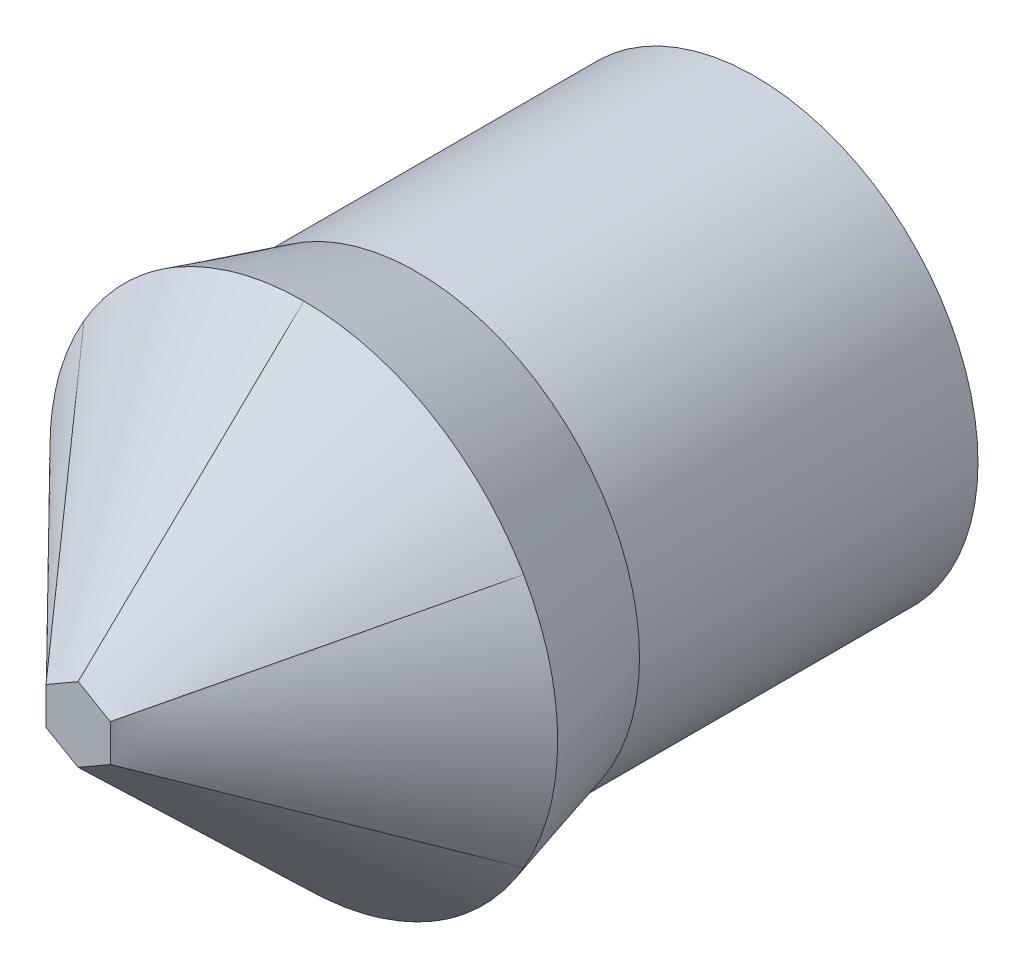
ISO-10303-21;
HEADER;
FILE_DESCRIPTION(('STEP AP214'),'2;1');
FILE_NAME('part.step','',(''),(''),'','','');
FILE_SCHEMA(('AUTOMOTIVE_DESIGN { 1 0 10303 214 1 1 1 1 }'));
ENDSEC;
DATA;
#1=APPLICATION_CONTEXT('core data for automotive mechanical design processes');
#2=APPLICATION_PROTOCOL_DEFINITION('international standard','automotive_design',2000,#1);
#3=PRODUCT_CONTEXT('',#1,'mechanical');
#4=PRODUCT('Part','Part','',(#3));
#5=PRODUCT_RELATED_PRODUCT_CATEGORY('part','',(#4));
#6=PRODUCT_DEFINITION_FORMATION('','',#4);
#7=PRODUCT_DEFINITION_CONTEXT('part definition',#1,'design');
#8=PRODUCT_DEFINITION('design','',#6,#7);
#9=PRODUCT_DEFINITION_SHAPE('','',#8);
#10=(LENGTH_UNIT() NAMED_UNIT(*) SI_UNIT(.MILLI.,.METRE.));
#11=(NAMED_UNIT(*) PLANE_ANGLE_UNIT() SI_UNIT($,.RADIAN.));
#12=(NAMED_UNIT(*) SI_UNIT($,.STERADIAN.) SOLID_ANGLE_UNIT());
#13=UNCERTAINTY_MEASURE_WITH_UNIT(LENGTH_MEASURE(1.E-05),#10,'distance_accuracy_value','');
#14=(GEOMETRIC_REPRESENTATION_CONTEXT(3) GLOBAL_UNCERTAINTY_ASSIGNED_CONTEXT((#13)) GLOBAL_UNIT_ASSIGNED_CONTEXT((#10,
#11,#12)) REPRESENTATION_CONTEXT('',''));
#15=CARTESIAN_POINT('',(0.,0.,0.));
#16=DIRECTION('',(0.,0.,1.));
#17=DIRECTION('',(1.,0.,0.));
#18=AXIS2_PLACEMENT_3D('',#15,#16,#17);
#19=CARTESIAN_POINT('',(0.,0.,6.));
#20=DIRECTION('',(0.,0.,-1.));
#21=DIRECTION('',(-1.,0.,0.));
#22=AXIS2_PLACEMENT_3D('',#19,#20,#21);
#23=CYLINDRICAL_SURFACE('',#22,3.95);
#24=CARTESIAN_POINT('',(0.,0.,6.));
#25=DIRECTION('',(0.,0.,1.));
#26=DIRECTION('',(1.,0.,0.));
#27=AXIS2_PLACEMENT_3D('',#24,#25,#26);
#28=CIRCLE('',#27,3.95);
#29=CARTESIAN_POINT('',(3.95,0.,6.));
#30=VERTEX_POINT('',#29);
#31=EDGE_CURVE('E12',#30,#30,#28,.T.);
#32=ORIENTED_EDGE('',*,*,#31,.F.);
#33=EDGE_LOOP('',(#32));
#34=FACE_BOUND('',#33,.T.);
#35=CARTESIAN_POINT('',(0.,0.,0.));
#36=DIRECTION('',(0.,0.,1.));
#37=DIRECTION('',(1.,0.,0.));
#38=AXIS2_PLACEMENT_3D('',#35,#36,#37);
#39=CIRCLE('',#38,3.95);
#40=CARTESIAN_POINT('',(3.95,0.,0.));
#41=VERTEX_POINT('',#40);
#42=EDGE_CURVE('E93',#41,#41,#39,.T.);
#43=ORIENTED_EDGE('',*,*,#42,.T.);
#44=EDGE_LOOP('',(#43));
#45=FACE_BOUND('',#44,.T.);
#46=ADVANCED_FACE('F79',(#34,#45),#23,.T.);
#47=CARTESIAN_POINT('',(0.,0.,0.));
#48=DIRECTION('',(0.,0.,1.));
#49=DIRECTION('',(1.,0.,0.));
#50=AXIS2_PLACEMENT_3D('',#47,#48,#49);
#51=PLANE('',#50);
#52=ORIENTED_EDGE('',*,*,#42,.F.);
#53=EDGE_LOOP('',(#52));
#54=FACE_BOUND('',#53,.T.);
#55=ADVANCED_FACE('F347',(#54),#51,.F.);
#56=CARTESIAN_POINT('',(0.,0.,6.));
#57=DIRECTION('',(0.,0.,1.));
#58=DIRECTION('',(1.,0.,0.));
#59=AXIS2_PLACEMENT_3D('',#56,#57,#58);
#60=CONICAL_SURFACE('',#59,3.95,0.268366210905907);
#61=CARTESIAN_POINT('',(3.89711431702996,2.25000000000002,8.));
#62=CARTESIAN_POINT('',(3.83869948859132,2.35118469901196,7.99997786592771));
#63=CARTESIAN_POINT('',(3.77632633594995,2.45008029614342,7.99994361975812));
#64=CARTESIAN_POINT('',(3.64409186469847,2.64271859279688,7.9998961356535));
#65=CARTESIAN_POINT('',(3.5742312422977,2.73646177018351,7.99988289576704));
#66=CARTESIAN_POINT('',(3.42746983719847,2.91820173295288,7.99992262747231));
#67=CARTESIAN_POINT('',(3.35057199542261,3.00620089271256,7.99997557152118));
#68=CARTESIAN_POINT('',(3.19014759800274,3.17594080167324,8.00000194954762));
#69=CARTESIAN_POINT('',(3.10662068043718,3.25768120869153,7.99997537918112));
#70=CARTESIAN_POINT('',(2.92630069769114,3.42089276675026,7.99990297746387));
#71=CARTESIAN_POINT('',(2.82898173858611,3.50178383342491,7.9998557362786));
#72=CARTESIAN_POINT('',(2.62789116936538,3.655112971937,7.99986826577641));
#73=CARTESIAN_POINT('',(2.52411913939189,3.72755049287534,7.99992804342954));
#74=CARTESIAN_POINT('',(2.31078114202031,3.86345315253236,7.99999055694166));
#75=CARTESIAN_POINT('',(2.20121226757145,3.92691372967728,7.99999326390326));
#76=CARTESIAN_POINT('',(1.97711679933967,4.04435992778029,7.99993350641128));
#77=CARTESIAN_POINT('',(1.86259043118812,4.09834597939026,7.99987104492077));
#78=CARTESIAN_POINT('',(1.62925090993429,4.19657320013805,7.99985422997382));
#79=CARTESIAN_POINT('',(1.51043218456386,4.24080113062967,7.99990002240919));
#80=CARTESIAN_POINT('',(1.26948604370674,4.31907188854427,7.99997299960417));
#81=CARTESIAN_POINT('',(1.14735870082292,4.3531149392628,8.00000018477175));
#82=CARTESIAN_POINT('',(0.900876460807223,4.41070757089264,7.99996996324173));
#83=CARTESIAN_POINT('',(0.776525631502978,4.43427460935293,7.99991269796791));
#84=CARTESIAN_POINT('',(0.526336265209896,4.47086571244883,7.99987987906786));
#85=CARTESIAN_POINT('',(0.400498643362854,4.48389595131681,7.9999042775461));
#86=CARTESIAN_POINT('',(0.228671865263345,4.49440692828431,7.99995356305243));
#87=CARTESIAN_POINT('',(0.182931033089695,4.49650476345946,7.99996821881014));
#88=CARTESIAN_POINT('',(0.0914618342334518,4.49930023941027,7.99999119306953));
#89=CARTESIAN_POINT('',(0.0457335190662117,4.49999956607741,7.99999951919402));
#90=CARTESIAN_POINT('',(0.,4.5,8.));
#91=B_SPLINE_CURVE_WITH_KNOTS('',3,(#61,#62,#63,#64,#65,#66,#67,#68,#69,#70,#71,#72,#73,#74,#75,
#76,#77,#78,#79,#80,#81,#82,#83,#84,#85,#86,#87,#88,#89,#90),.UNSPECIFIED.,.F.,.F.,(4,2,2,2,2,2,
2,2,2,2,2,2,2,2,4),(0.,0.350414037495728,0.700795520573946,1.05103123873107,1.40128609155702,
1.78047577510983,2.15969015584303,2.53909654489169,2.91848568406207,3.29838641035107,
3.67827880700273,4.05753574402924,4.4365702870822,4.57392082064536,4.71110567912155),.UNSPECIFIED.);
#92=CARTESIAN_POINT('',(3.89711431702996,2.25000000000002,8.));
#93=VERTEX_POINT('',#92);
#94=CARTESIAN_POINT('',(0.,4.5,8.));
#95=VERTEX_POINT('',#94);
#96=EDGE_CURVE('E281',#93,#95,#91,.T.);
#97=ORIENTED_EDGE('',*,*,#96,.F.);
#98=CARTESIAN_POINT('',(3.89711431696637,-2.25000000011016,8.));
#99=CARTESIAN_POINT('',(3.95553542256847,-2.1488189252204,7.99997786592775));
#100=CARTESIAN_POINT('',(4.00999494568894,-2.04535439195478,7.99994361975816));
#101=CARTESIAN_POINT('',(4.11070736871271,-1.83451683227136,7.99989613565352));
#102=CARTESIAN_POINT('',(4.1569610305636,-1.72714416985622,7.99988289576704));
#103=CARTESIAN_POINT('',(4.24097175266122,-1.50917508336312,7.99992262747228));
#104=CARTESIAN_POINT('',(4.27873233963997,-1.39858001901035,7.99997557152114));
#105=CARTESIAN_POINT('',(4.34551921413238,-1.1747784609797,8.00000194954762));
#106=CARTESIAN_POINT('',(4.37454502434633,-1.0615718249599,7.99997537918115));
#107=CARTESIAN_POINT('',(4.42573038845076,-0.823804360061409,7.99990297746393));
#108=CARTESIAN_POINT('',(4.44712462758161,-0.699078135867184,7.99985573627862));
#109=CARTESIAN_POINT('',(4.4793662720705,-0.448264025199998,7.99986826577638));
#110=CARTESIAN_POINT('',(4.49021299040702,-0.322176050569078,7.99992804342949));
#111=CARTESIAN_POINT('',(4.50123914743263,-0.0694685954191576,7.99999055694164));
#112=CARTESIAN_POINT('',(4.50141318215759,0.0571511218927791,7.99999326390327));
#113=CARTESIAN_POINT('',(4.49107683918246,0.309946589311604,7.99993350641133));
#114=CARTESIAN_POINT('',(4.48056694725351,0.43612235934192,7.99987104492079));
#115=CARTESIAN_POINT('',(4.44896445514235,0.687313922831852,7.9998542299738));
#116=CARTESIAN_POINT('',(4.42785760382236,0.812327922694153,7.99990002240915));
#117=CARTESIAN_POINT('',(4.37516899812663,1.06012878057862,7.99997299960414));
#118=CARTESIAN_POINT('',(4.34358747343194,1.18291568737261,8.00000018477176));
#119=CARTESIAN_POINT('',(4.27022303549153,1.42517188462435,7.99996996324176));
#120=CARTESIAN_POINT('',(4.22845727484055,1.54464638101453,7.99991269796793));
#121=CARTESIAN_POINT('',(4.13505141653259,1.77961227953101,7.99987987906785));
#122=CARTESIAN_POINT('',(4.08341712348858,1.89510597623746,7.99990427754608));
#123=CARTESIAN_POINT('',(4.00660650750739,2.04916781962187,7.9999535630524));
#124=CARTESIAN_POINT('',(3.98555286996846,2.08982945987669,7.99996821881012));
#125=CARTESIAN_POINT('',(3.94223922371505,2.17044184775419,7.99999119306953));
#126=CARTESIAN_POINT('',(3.91998070078312,2.210393393709,7.99999951919402));
#127=CARTESIAN_POINT('',(3.89711431702996,2.25000000000002,8.));
#128=B_SPLINE_CURVE_WITH_KNOTS('',3,(#98,#99,#100,#101,#102,#103,#104,#105,#106,#107,#108,#109,
#110,#111,#112,#113,#114,#115,#116,#117,#118,#119,#120,#121,#122,#123,#124,#125,#126,#127),
.UNSPECIFIED.,.F.,.F.,(4,2,2,2,2,2,2,2,2,2,2,2,2,2,4),(0.,0.350414037495326,0.700795520573139,
1.05103123872996,1.4012860915556,1.78047577511653,2.15969015585786,2.5390965449146,
2.91848568409305,3.29838641038196,3.67827880703352,4.05753574406002,4.43657028711298,
4.57392082072439,4.71110567924874),.UNSPECIFIED.);
#129=CARTESIAN_POINT('',(3.89711431699818,-2.25000000005507,8.));
#130=VERTEX_POINT('',#129);
#131=EDGE_CURVE('E82',#130,#93,#128,.T.);
#132=ORIENTED_EDGE('',*,*,#131,.F.);
#133=CARTESIAN_POINT('',(0.,-4.5,8.));
#134=CARTESIAN_POINT('',(0.116835934037945,-4.50000362412039,7.99997786592771));
#135=CARTESIAN_POINT('',(0.233668609796913,-4.49543468798458,7.99994361975812));
#136=CARTESIAN_POINT('',(0.466615504066309,-4.47723542495152,7.9998961356535));
#137=CARTESIAN_POINT('',(0.582729788314997,-4.46360593992157,7.99988289576705));
#138=CARTESIAN_POINT('',(0.813501915505715,-4.42737681619524,7.99992262747232));
#139=CARTESIAN_POINT('',(0.928160344257211,-4.40478091160098,7.99997557152118));
#140=CARTESIAN_POINT('',(1.15537161616314,-4.35071926252891,8.00000194954763));
#141=CARTESIAN_POINT('',(1.26792434393943,-4.31925303352648,7.99997537918112));
#142=CARTESIAN_POINT('',(1.49942969078253,-4.2446971266878,7.99990297746388));
#143=CARTESIAN_POINT('',(1.6181428890145,-4.20086196917031,7.9998557362786));
#144=CARTESIAN_POINT('',(1.85147510271671,-4.10337699701975,7.99986826577641));
#145=CARTESIAN_POINT('',(1.96609385102322,-4.0497265433296,7.99992804342954));
#146=CARTESIAN_POINT('',(2.19045800541386,-3.93292174784183,7.99999055694166));
#147=CARTESIAN_POINT('',(2.30020091458462,-3.86976260767751,7.99999326390325));
#148=CARTESIAN_POINT('',(2.51396003983563,-3.73441333836733,7.99993350641128));
#149=CARTESIAN_POINT('',(2.61797651605566,-3.6622236199499,7.99987104492077));
#150=CARTESIAN_POINT('',(2.81971354519334,-3.50925927721106,7.99985422997382));
#151=CARTESIAN_POINT('',(2.91742541924112,-3.42847320784078,7.99990002240919));
#152=CARTESIAN_POINT('',(3.10568295439723,-3.25894310787195,7.99997299960417));
#153=CARTESIAN_POINT('',(3.19622877258372,-3.17019925179712,8.00000018477176));
#154=CARTESIAN_POINT('',(3.36934657465381,-2.98553568617675,7.99996996324173));
#155=CARTESIAN_POINT('',(3.45193164330449,-2.88962822824777,7.99991269796791));
#156=CARTESIAN_POINT('',(3.60871515128455,-2.69125343282921,7.99987987906786));
#157=CARTESIAN_POINT('',(3.68291848008511,-2.58878997499186,7.9999042775461));
#158=CARTESIAN_POINT('',(3.77793464219558,-2.44523910860873,7.99995356305242));
#159=CARTESIAN_POINT('',(3.80262183682587,-2.40667530356173,7.99996821881013));
#160=CARTESIAN_POINT('',(3.85077738942185,-2.32885839170055,7.99999119306951));
#161=CARTESIAN_POINT('',(3.87424718165473,-2.28960617244571,7.999999519194));
#162=CARTESIAN_POINT('',(3.89711431696637,-2.25000000011017,8.));
#163=B_SPLINE_CURVE_WITH_KNOTS('',3,(#133,#134,#135,#136,#137,#138,#139,#140,#141,#142,#143,
#144,#145,#146,#147,#148,#149,#150,#151,#152,#153,#154,#155,#156,#157,#158,#159,#160,#161,#162),
.UNSPECIFIED.,.F.,.F.,(4,2,2,2,2,2,2,2,2,2,2,2,2,2,4),(0.,0.350414037495737,0.700795520573963,
1.05103123873106,1.40128609155698,1.78047577510977,2.15969015584295,2.53909654489163,
2.91848568406203,3.2983864103511,3.67827880700283,4.05753574402929,4.43657028708217,
4.57392082058167,4.71110567899435),.UNSPECIFIED.);
#164=CARTESIAN_POINT('',(0.,-4.5,8.));
#165=VERTEX_POINT('',#164);
#166=EDGE_CURVE('E240',#165,#130,#163,.T.);
#167=ORIENTED_EDGE('',*,*,#166,.F.);
#168=CARTESIAN_POINT('',(-3.89711431691449,-2.25000000020003,8.));
#169=CARTESIAN_POINT('',(-3.83869948847063,-2.35118469920896,7.99997786592764));
#170=CARTESIAN_POINT('',(-3.77632633582419,-2.45008029633723,7.99994361975804));
#171=CARTESIAN_POINT('',(-3.64409186456283,-2.64271859298391,7.99989613565347));
#172=CARTESIAN_POINT('',(-3.57423124215725,-2.73646177036697,7.99988289576706));
#173=CARTESIAN_POINT('',(-3.42746983704872,-2.9182017331288,7.99992262747239));
#174=CARTESIAN_POINT('',(-3.35057199526835,-3.00620089288453,7.99997557152126));
#175=CARTESIAN_POINT('',(-3.19014759783977,-3.17594080183694,8.00000194954764));
#176=CARTESIAN_POINT('',(-3.10662068027002,-3.25768120885092,7.99997537918105));
#177=CARTESIAN_POINT('',(-2.92630069751556,-3.42089276690042,7.99990297746378));
#178=CARTESIAN_POINT('',(-2.82898173840634,-3.50178383357012,7.99985573627856));
#179=CARTESIAN_POINT('',(-2.62789116917766,-3.65511297207198,7.99986826577647));
#180=CARTESIAN_POINT('',(-2.52411913920041,-3.72755049300504,7.99992804342965));
#181=CARTESIAN_POINT('',(-2.31078114182171,-3.86345315265116,7.99999055694172));
#182=CARTESIAN_POINT('',(-2.20121226736951,-3.92691372979047,7.9999932639032));
#183=CARTESIAN_POINT('',(-1.97711679913152,-4.04435992788202,7.99993350641118));
#184=CARTESIAN_POINT('',(-1.86259043097712,-4.09834597948614,7.99987104492071));
#185=CARTESIAN_POINT('',(-1.62925090971808,-4.196573200222,7.99985422997386));
#186=CARTESIAN_POINT('',(-1.51043218434531,-4.24080113070754,7.99990002240929));
#187=CARTESIAN_POINT('',(-1.26948604348398,-4.31907188860977,7.99997299960425));
#188=CARTESIAN_POINT('',(-1.14735870059832,-4.353114939322,8.00000018477174));
#189=CARTESIAN_POINT('',(-0.900876460579564,-4.41070757093912,7.99996996324165));
#190=CARTESIAN_POINT('',(-0.776525631274102,-4.43427460939299,7.99991269796785));
#191=CARTESIAN_POINT('',(-0.526336264979133,-4.470865712476,7.99987987906786));
#192=CARTESIAN_POINT('',(-0.400498643131422,-4.4838959513375,7.99990427754616));
#193=CARTESIAN_POINT('',(-0.228671865070076,-4.49440692829377,7.99995356305249));
#194=CARTESIAN_POINT('',(-0.182931032935067,-4.49650476346537,7.99996821881019));
#195=CARTESIAN_POINT('',(-0.0914618341561338,-4.49930023941145,7.99999119306955));
#196=CARTESIAN_POINT('',(-0.0457335190275613,-4.49999956607741,7.99999951919403));
#197=CARTESIAN_POINT('',(0.,-4.5,8.));
#198=B_SPLINE_CURVE_WITH_KNOTS('',3,(#168,#169,#170,#171,#172,#173,#174,#175,#176,#177,#178,
#179,#180,#181,#182,#183,#184,#185,#186,#187,#188,#189,#190,#191,#192,#193,#194,#195,#196,#197),
.UNSPECIFIED.,.F.,.F.,(4,2,2,2,2,2,2,2,2,2,2,2,2,2,4),(0.,0.350414037495747,0.700795520573976,
1.05103123873105,1.40128609155695,1.78047577510995,2.15969015584333,2.53909654489225,
2.91848568406289,3.29838641035214,3.67827880700404,4.05753574403057,4.4365702870835,
4.57392082053041,4.71110567889061),.UNSPECIFIED.);
#199=CARTESIAN_POINT('',(-3.89711431691449,-2.25000000020003,8.));
#200=VERTEX_POINT('',#199);
#201=EDGE_CURVE('E243',#200,#165,#198,.T.);
#202=ORIENTED_EDGE('',*,*,#201,.F.);
#203=CARTESIAN_POINT('',(-3.89711431696638,2.25000000011015,8.));
#204=CARTESIAN_POINT('',(-3.95553542256847,2.1488189252204,7.99997786592775));
#205=CARTESIAN_POINT('',(-4.00999494568893,2.04535439195479,7.99994361975816));
#206=CARTESIAN_POINT('',(-4.11070736871269,1.83451683227141,7.99989613565352));
#207=CARTESIAN_POINT('',(-4.15696103056358,1.72714416985628,7.99988289576704));
#208=CARTESIAN_POINT('',(-4.24097175266119,1.50917508336319,7.99992262747228));
#209=CARTESIAN_POINT('',(-4.27873233963995,1.39858001901042,7.99997557152114));
#210=CARTESIAN_POINT('',(-4.34551921413236,1.17477846097975,8.00000194954762));
#211=CARTESIAN_POINT('',(-4.37454502434632,1.06157182495995,7.99997537918115));
#212=CARTESIAN_POINT('',(-4.42573038845075,0.823804360061444,7.99990297746393));
#213=CARTESIAN_POINT('',(-4.44712462758161,0.699078135867205,7.99985573627862));
#214=CARTESIAN_POINT('',(-4.4793662720705,0.448264025199993,7.99986826577638));
#215=CARTESIAN_POINT('',(-4.49021299040702,0.32217605056906,7.99992804342949));
#216=CARTESIAN_POINT('',(-4.50123914743263,0.0694685954191407,7.99999055694164));
#217=CARTESIAN_POINT('',(-4.50141318215759,-0.0571511218927821,7.99999326390327));
#218=CARTESIAN_POINT('',(-4.49107683918246,-0.30994658931158,7.99993350641133));
#219=CARTESIAN_POINT('',(-4.48056694725351,-0.436122359341883,7.99987104492079));
#220=CARTESIAN_POINT('',(-4.44896445514237,-0.687313922831761,7.9998542299738));
#221=CARTESIAN_POINT('',(-4.42785760382239,-0.812327922694021,7.99990002240915));
#222=CARTESIAN_POINT('',(-4.37516899812668,-1.06012878057841,7.99997299960414));
#223=CARTESIAN_POINT('',(-4.34358747343201,-1.18291568737236,8.00000018477176));
#224=CARTESIAN_POINT('',(-4.27022303549162,-1.4251718846241,7.99996996324177));
#225=CARTESIAN_POINT('',(-4.22845727484063,-1.54464638101431,7.99991269796794));
#226=CARTESIAN_POINT('',(-4.13505141653265,-1.77961227953087,7.99987987906785));
#227=CARTESIAN_POINT('',(-4.08341712348864,-1.89510597623736,7.99990427754608));
#228=CARTESIAN_POINT('',(-4.00660650749022,-2.04916781965631,7.99995356305241));
#229=CARTESIAN_POINT('',(-3.98555286993304,-2.0898294599451,7.99996821881015));
#230=CARTESIAN_POINT('',(-3.94223922364112,-2.17044184788931,7.99999119306956));
#231=CARTESIAN_POINT('',(-3.91998070068892,-2.21039339387687,7.99999951919404));
#232=CARTESIAN_POINT('',(-3.89711431691449,-2.25000000020003,8.));
#233=B_SPLINE_CURVE_WITH_KNOTS('',3,(#203,#204,#205,#206,#207,#208,#209,#210,#211,#212,#213,
#214,#215,#216,#217,#218,#219,#220,#221,#222,#223,#224,#225,#226,#227,#228,#229,#230,#231,#232),
.UNSPECIFIED.,.F.,.F.,(4,2,2,2,2,2,2,2,2,2,2,2,2,2,4),(0.,0.350414037495281,0.700795520573049,
1.05103123872988,1.40128609155554,1.78047577511651,2.15969015585788,2.53909654491458,
2.91848568409299,3.29838641038177,3.67827880703321,4.0575357440598,4.43657028711291,
4.57392082083993,4.71110567947965),.UNSPECIFIED.);
#234=CARTESIAN_POINT('',(-3.89711431696638,2.25000000011015,8.));
#235=VERTEX_POINT('',#234);
#236=EDGE_CURVE('E289',#235,#200,#233,.T.);
#237=ORIENTED_EDGE('',*,*,#236,.F.);
#238=CARTESIAN_POINT('',(0.,4.5,8.));
#239=CARTESIAN_POINT('',(-0.116835934037972,4.50000362412039,7.99997786592771));
#240=CARTESIAN_POINT('',(-0.233668609796946,4.49543468798458,7.99994361975812));
#241=CARTESIAN_POINT('',(-0.466615504066351,4.47723542495152,7.9998961356535));
#242=CARTESIAN_POINT('',(-0.582729788315043,4.46360593992157,7.99988289576705));
#243=CARTESIAN_POINT('',(-0.813501915505769,4.42737681619523,7.99992262747232));
#244=CARTESIAN_POINT('',(-0.928160344257269,4.40478091160097,7.99997557152118));
#245=CARTESIAN_POINT('',(-1.1553716161632,4.3507192625289,8.00000194954763));
#246=CARTESIAN_POINT('',(-1.26792434393949,4.31925303352646,7.99997537918112));
#247=CARTESIAN_POINT('',(-1.4994296907826,4.24469712668778,7.99990297746388));
#248=CARTESIAN_POINT('',(-1.61814288901457,4.20086196917029,7.9998557362786));
#249=CARTESIAN_POINT('',(-1.85147510271678,4.10337699701971,7.99986826577641));
#250=CARTESIAN_POINT('',(-1.96609385102329,4.04972654332957,7.99992804342954));
#251=CARTESIAN_POINT('',(-2.19045800541393,3.93292174784179,7.99999055694166));
#252=CARTESIAN_POINT('',(-2.30020091458468,3.86976260767747,7.99999326390325));
#253=CARTESIAN_POINT('',(-2.5139600398357,3.73441333836728,7.99993350641128));
#254=CARTESIAN_POINT('',(-2.61797651605572,3.66222361994985,7.99987104492077));
#255=CARTESIAN_POINT('',(-2.8197135451934,3.50925927721101,7.99985422997382));
#256=CARTESIAN_POINT('',(-2.91742541924118,3.42847320784073,7.99990002240919));
#257=CARTESIAN_POINT('',(-3.10568295439728,3.2589431078719,7.99997299960418));
#258=CARTESIAN_POINT('',(-3.19622877258377,3.17019925179707,8.00000018477176));
#259=CARTESIAN_POINT('',(-3.36934657465386,2.98553568617669,7.99996996324173));
#260=CARTESIAN_POINT('',(-3.45193164330454,2.88962822824771,7.99991269796791));
#261=CARTESIAN_POINT('',(-3.6087151512846,2.69125343282915,7.99987987906786));
#262=CARTESIAN_POINT('',(-3.68291848008515,2.58878997499179,7.9999042775461));
#263=CARTESIAN_POINT('',(-3.77793464219562,2.44523910860867,7.99995356305242));
#264=CARTESIAN_POINT('',(-3.8026218368259,2.40667530356168,7.99996821881013));
#265=CARTESIAN_POINT('',(-3.85077738942187,2.32885839170052,7.99999119306951));
#266=CARTESIAN_POINT('',(-3.87424718165474,2.28960617244569,7.999999519194));
#267=CARTESIAN_POINT('',(-3.89711431696637,2.25000000011015,8.));
#268=B_SPLINE_CURVE_WITH_KNOTS('',3,(#238,#239,#240,#241,#242,#243,#244,#245,#246,#247,#248,
#249,#250,#251,#252,#253,#254,#255,#256,#257,#258,#259,#260,#261,#262,#263,#264,#265,#266,#267),
.UNSPECIFIED.,.F.,.F.,(4,2,2,2,2,2,2,2,2,2,2,2,2,2,4),(0.,0.350414037495751,0.70079552057399,
1.0510312387311,1.40128609155704,1.78047577510983,2.159690155843,2.53909654489169,
2.91848568406209,3.29838641035116,3.67827880700288,4.05753574402934,4.43657028708222,
4.57392082058169,4.71110567899434),.UNSPECIFIED.);
#269=EDGE_CURVE('E141',#95,#235,#268,.T.);
#270=ORIENTED_EDGE('',*,*,#269,.F.);
#271=EDGE_LOOP('',(#97,#132,#167,#202,#237,#270));
#272=FACE_BOUND('',#271,.T.);
#273=ORIENTED_EDGE('',*,*,#31,.T.);
#274=EDGE_LOOP('',(#273));
#275=FACE_BOUND('',#274,.T.);
#276=ADVANCED_FACE('F181',(#272,#275),#60,.T.);
#277=CARTESIAN_POINT('',(0.,0.,12.));
#278=DIRECTION('',(0.,0.,1.));
#279=DIRECTION('',(1.,0.,0.));
#280=AXIS2_PLACEMENT_3D('',#277,#278,#279);
#281=PLANE('',#280);
#282=DIRECTION('',(0.866025403784442,-0.499999999999995,0.));
#283=VECTOR('',#282,1.);
#284=CARTESIAN_POINT('',(-0.569872716403309,-0.329016166219283,12.));
#285=LINE('',#284,#283);
#286=CARTESIAN_POINT('',(-0.569872716403309,-0.329016166219283,12.));
#287=VERTEX_POINT('',#286);
#288=CARTESIAN_POINT('',(0.,-0.658032332438552,12.));
#289=VERTEX_POINT('',#288);
#290=EDGE_CURVE('E220',#287,#289,#285,.T.);
#291=ORIENTED_EDGE('',*,*,#290,.T.);
#292=DIRECTION('',(0.866025403784438,0.500000000000001,0.));
#293=VECTOR('',#292,1.);
#294=CARTESIAN_POINT('',(0.,-0.658032332438552,12.));
#295=LINE('',#294,#293);
#296=CARTESIAN_POINT('',(0.569872716403313,-0.329016166219275,12.));
#297=VERTEX_POINT('',#296);
#298=EDGE_CURVE('E212',#289,#297,#295,.T.);
#299=ORIENTED_EDGE('',*,*,#298,.T.);
#300=DIRECTION('',(0.,1.,0.));
#301=VECTOR('',#300,1.);
#302=CARTESIAN_POINT('',(0.569872716403313,-0.329016166219275,12.));
#303=LINE('',#302,#301);
#304=CARTESIAN_POINT('',(0.569872716403311,0.329016166219279,12.));
#305=VERTEX_POINT('',#304);
#306=EDGE_CURVE('E219',#297,#305,#303,.T.);
#307=ORIENTED_EDGE('',*,*,#306,.T.);
#308=DIRECTION('',(-0.866025403784441,0.499999999999995,0.));
#309=VECTOR('',#308,1.);
#310=CARTESIAN_POINT('',(0.569872716403311,0.329016166219279,12.));
#311=LINE('',#310,#309);
#312=CARTESIAN_POINT('',(0.,0.658032332438552,12.));
#313=VERTEX_POINT('',#312);
#314=EDGE_CURVE('E162',#305,#313,#311,.T.);
#315=ORIENTED_EDGE('',*,*,#314,.T.);
#316=DIRECTION('',(-0.866025403784435,-0.500000000000007,0.));
#317=VECTOR('',#316,1.);
#318=CARTESIAN_POINT('',(0.,0.658032332438552,12.));
#319=LINE('',#318,#317);
#320=CARTESIAN_POINT('',(-0.569872716403316,0.329016166219271,12.));
#321=VERTEX_POINT('',#320);
#322=EDGE_CURVE('E138',#313,#321,#319,.T.);
#323=ORIENTED_EDGE('',*,*,#322,.T.);
#324=DIRECTION('',(0.,-1.,0.));
#325=VECTOR('',#324,1.);
#326=CARTESIAN_POINT('',(-0.569872716403316,0.329016166219271,12.));
#327=LINE('',#326,#325);
#328=EDGE_CURVE('E148',#321,#287,#327,.T.);
#329=ORIENTED_EDGE('',*,*,#328,.T.);
#330=EDGE_LOOP('',(#291,#299,#307,#315,#323,#329));
#331=FACE_BOUND('',#330,.T.);
#332=ADVANCED_FACE('F160',(#331),#281,.T.);
#333=CARTESIAN_POINT('',(-0.569872716403309,-0.329016166219282,12.));
#334=CARTESIAN_POINT('',(-3.89711431702995,-2.25000000000004,8.));
#335=CARTESIAN_POINT('',(-3.93038673303622,-2.26920983833785,7.96));
#336=CARTESIAN_POINT('',(-0.569872716403309,-0.27418013851607,12.));
#337=CARTESIAN_POINT('',(-4.08461431702995,-1.92524047358088,8.));
#338=CARTESIAN_POINT('',(-4.11976173303622,-1.94175107693152,7.96));
#339=CARTESIAN_POINT('',(-0.56987271640331,-0.219344110812857,12.));
#340=CARTESIAN_POINT('',(-4.2373749769306,-1.56542307169307,8.));
#341=CARTESIAN_POINT('',(-4.27404999953587,-1.57888386130187,7.96));
#342=CARTESIAN_POINT('',(-0.569872716403311,-0.109672055406431,12.));
#343=CARTESIAN_POINT('',(-4.44523642827262,-0.803597651355799,8.));
#344=CARTESIAN_POINT('',(-4.48399006539132,-0.810536907315293,7.96));
#345=CARTESIAN_POINT('',(-0.569872716403312,-0.0548360277032186,12.));
#346=CARTESIAN_POINT('',(-4.5,-0.401923788646724,8.));
#347=CARTESIAN_POINT('',(-4.53930127283596,-0.405394666256159,7.96));
#348=CARTESIAN_POINT('',(-0.569872716403313,0.0548360277032069,12.));
#349=CARTESIAN_POINT('',(-4.5,0.401923788646647,8.));
#350=CARTESIAN_POINT('',(-4.53930127283597,0.405394666256081,7.96));
#351=CARTESIAN_POINT('',(-0.569872716403313,0.10967205540642,12.));
#352=CARTESIAN_POINT('',(-4.44523642827264,0.803597651355724,8.));
#353=CARTESIAN_POINT('',(-4.48399006539133,0.810536907315217,7.96));
#354=CARTESIAN_POINT('',(-0.569872716403315,0.219344110812845,12.));
#355=CARTESIAN_POINT('',(-4.23737497693062,1.56542307169299,8.));
#356=CARTESIAN_POINT('',(-4.2740499995359,1.5788838613018,7.96));
#357=CARTESIAN_POINT('',(-0.569872716403315,0.274180138516058,12.));
#358=CARTESIAN_POINT('',(-4.08461431702999,1.92524047358081,8.));
#359=CARTESIAN_POINT('',(-4.11976173303625,1.94175107693145,7.96));
#360=CARTESIAN_POINT('',(-0.569872716403316,0.329016166219271,12.));
#361=CARTESIAN_POINT('',(-3.89711431702999,2.24999999999997,8.));
#362=CARTESIAN_POINT('',(-3.93038673303626,2.26920983833778,7.96));
#363=B_SPLINE_SURFACE_WITH_KNOTS('',3,1,((#333,#334,#335),(#336,#337,#338),(#339,#340,#341),
(#342,#343,#344),(#345,#346,#347),(#348,#349,#350),(#351,#352,#353),(#354,#355,#356),(#357,#358,
#359),(#360,#361,#362)),.UNSPECIFIED.,.F.,.F.,.F.,(4,2,2,2,4),(2,1,2),(0.,0.25,0.5,0.75,1.),(0.,
1.,1.01),.UNSPECIFIED.);
#364=DIRECTION('',(-0.599910026443743,0.346358215256846,-0.721210057401004));
#365=VECTOR('',#364,1.);
#366=CARTESIAN_POINT('',(-2.23349351671665,1.28950808310962,10.));
#367=LINE('',#366,#365);
#368=EDGE_CURVE('E133',#321,#235,#367,.T.);
#369=DIRECTION('',(0.599910026443737,0.346358215256855,0.721210057401004));
#370=VECTOR('',#369,1.);
#371=CARTESIAN_POINT('',(-2.23349351671663,-1.28950808310966,10.));
#372=LINE('',#371,#370);
#373=EDGE_CURVE('E145',#200,#287,#372,.T.);
#374=ORIENTED_EDGE('',*,*,#328,.F.);
#375=ORIENTED_EDGE('',*,*,#368,.T.);
#376=ORIENTED_EDGE('',*,*,#236,.T.);
#377=ORIENTED_EDGE('',*,*,#373,.T.);
#378=EDGE_LOOP('',(#374,#375,#376,#377));
#379=FACE_BOUND('',#378,.T.);
#380=ADVANCED_FACE('F150',(#379),#363,.T.);
#381=CARTESIAN_POINT('',(-0.569872716403316,0.329016166219271,12.));
#382=CARTESIAN_POINT('',(-3.89711431702999,2.24999999999997,8.));
#383=CARTESIAN_POINT('',(-3.93038673303626,2.26920983833778,7.96));
#384=CARTESIAN_POINT('',(-0.522383323369707,0.356434180070877,12.));
#385=CARTESIAN_POINT('',(-3.70961431702999,2.57475952641914,8.));
#386=CARTESIAN_POINT('',(-3.74148662696659,2.59694277988262,7.96));
#387=CARTESIAN_POINT('',(-0.474893930336097,0.383852193922484,12.));
#388=CARTESIAN_POINT('',(-3.47438363622175,2.88696283953587,8.));
#389=CARTESIAN_POINT('',(-3.50437853328061,2.91199394599201,7.96));
#390=CARTESIAN_POINT('',(-0.379915144268879,0.438688221625698,12.));
#391=CARTESIAN_POINT('',(-2.91855419463193,3.4478888470342,8.));
#392=CARTESIAN_POINT('',(-2.94394058513556,3.47798085328829,7.96));
#393=CARTESIAN_POINT('',(-0.33242575123527,0.466106235477304,12.));
#394=CARTESIAN_POINT('',(-2.59807621135334,3.69615242270662,8.));
#395=CARTESIAN_POINT('',(-2.62073271595452,3.72845288457891,7.96));
#396=CARTESIAN_POINT('',(-0.237446965168051,0.520942263180518,12.));
#397=CARTESIAN_POINT('',(-1.90192378864671,4.0980762113533,8.));
#398=CARTESIAN_POINT('',(-1.9185685568815,4.13384755083503,7.96));
#399=CARTESIAN_POINT('',(-0.189957572134442,0.548360277032125,12.));
#400=CARTESIAN_POINT('',(-1.52668223364074,4.25148649838997,8.));
#401=CARTESIAN_POINT('',(-1.54004948025581,4.28851776060355,7.96));
#402=CARTESIAN_POINT('',(-0.0949787860672232,0.603196304735338,12.));
#403=CARTESIAN_POINT('',(-0.762991340708903,4.45238591122892,8.));
#404=CARTESIAN_POINT('',(-0.76967146625532,4.49087780729385,7.96));
#405=CARTESIAN_POINT('',(-0.0474893930336139,0.630614318586945,12.));
#406=CARTESIAN_POINT('',(-0.375000000000027,4.5,8.));
#407=CARTESIAN_POINT('',(-0.378275106069691,4.53869385681413,7.96));
#408=CARTESIAN_POINT('',(0.,0.658032332438552,12.));
#409=CARTESIAN_POINT('',(0.,4.5,8.));
#410=CARTESIAN_POINT('',(0.,4.53841967667561,7.96));
#411=B_SPLINE_SURFACE_WITH_KNOTS('',3,1,((#381,#382,#383),(#384,#385,#386),(#387,#388,#389),
(#390,#391,#392),(#393,#394,#395),(#396,#397,#398),(#399,#400,#401),(#402,#403,#404),(#405,#406,
#407),(#408,#409,#410)),.UNSPECIFIED.,.F.,.F.,.F.,(4,2,2,2,4),(2,1,2),(0.,0.25,0.5,0.75,1.),(0.,
1.,1.01),.UNSPECIFIED.);
#412=DIRECTION('',(0.,0.692716430513699,-0.721210057401004));
#413=VECTOR('',#412,1.);
#414=CARTESIAN_POINT('',(0.,2.57901616621928,10.));
#415=LINE('',#414,#413);
#416=EDGE_CURVE('E144',#313,#95,#415,.T.);
#417=ORIENTED_EDGE('',*,*,#322,.F.);
#418=ORIENTED_EDGE('',*,*,#416,.T.);
#419=ORIENTED_EDGE('',*,*,#269,.T.);
#420=ORIENTED_EDGE('',*,*,#368,.F.);
#421=EDGE_LOOP('',(#417,#418,#419,#420));
#422=FACE_BOUND('',#421,.T.);
#423=ADVANCED_FACE('F135',(#422),#411,.T.);
#424=CARTESIAN_POINT('',(0.,-0.658032332438552,12.));
#425=CARTESIAN_POINT('',(0.,-4.5,8.));
#426=CARTESIAN_POINT('',(0.,-4.53841967667561,7.96));
#427=CARTESIAN_POINT('',(-0.0474893930336089,-0.630614318586946,12.));
#428=CARTESIAN_POINT('',(-0.374999999999994,-4.5,8.));
#429=CARTESIAN_POINT('',(-0.378275106069657,-4.53869385681413,7.96));
#430=CARTESIAN_POINT('',(-0.0949787860672179,-0.60319630473534,12.));
#431=CARTESIAN_POINT('',(-0.762991340708867,-4.45238591122892,8.));
#432=CARTESIAN_POINT('',(-0.769671466255283,-4.49087780729386,7.96));
#433=CARTESIAN_POINT('',(-0.189957572134436,-0.548360277032129,12.));
#434=CARTESIAN_POINT('',(-1.5266822336407,-4.25148649838999,8.00000000000001));
#435=CARTESIAN_POINT('',(-1.54004948025576,-4.28851776060356,7.96000000000001));
#436=CARTESIAN_POINT('',(-0.237446965168045,-0.520942263180523,12.));
#437=CARTESIAN_POINT('',(-1.90192378864666,-4.09807621135333,8.));
#438=CARTESIAN_POINT('',(-1.91856855688145,-4.13384755083505,7.96));
#439=CARTESIAN_POINT('',(-0.332425751235263,-0.466106235477311,12.));
#440=CARTESIAN_POINT('',(-2.59807621135329,-3.69615242270665,8.));
#441=CARTESIAN_POINT('',(-2.62073271595447,-3.72845288457894,7.96));
#442=CARTESIAN_POINT('',(-0.379915144268872,-0.438688221625706,12.));
#443=CARTESIAN_POINT('',(-2.91855419463189,-3.44788884703424,8.));
#444=CARTESIAN_POINT('',(-2.94394058513552,-3.47798085328833,7.96));
#445=CARTESIAN_POINT('',(-0.474893930336091,-0.383852193922494,12.));
#446=CARTESIAN_POINT('',(-3.47438363622171,-2.88696283953593,8.00000000000001));
#447=CARTESIAN_POINT('',(-3.50437853328056,-2.91199394599206,7.96000000000001));
#448=CARTESIAN_POINT('',(-0.5223833233697,-0.356434180070888,12.));
#449=CARTESIAN_POINT('',(-3.70961431702995,-2.5747595264192,8.));
#450=CARTESIAN_POINT('',(-3.74148662696655,-2.59694277988268,7.96));
#451=CARTESIAN_POINT('',(-0.569872716403309,-0.329016166219283,12.));
#452=CARTESIAN_POINT('',(-3.89711431702995,-2.25000000000004,8.));
#453=CARTESIAN_POINT('',(-3.93038673303622,-2.26920983833785,7.96));
#454=B_SPLINE_SURFACE_WITH_KNOTS('',3,1,((#424,#425,#426),(#427,#428,#429),(#430,#431,#432),
(#433,#434,#435),(#436,#437,#438),(#439,#440,#441),(#442,#443,#444),(#445,#446,#447),(#448,#449,
#450),(#451,#452,#453)),.UNSPECIFIED.,.F.,.F.,.F.,(4,2,2,2,4),(2,1,2),(0.,0.25,0.5,0.75,1.),(0.,
1.,1.01),.UNSPECIFIED.);
#455=DIRECTION('',(0.,-0.692716430513699,-0.721210057401004));
#456=VECTOR('',#455,1.);
#457=CARTESIAN_POINT('',(0.,-2.57901616621928,10.));
#458=LINE('',#457,#456);
#459=EDGE_CURVE('E241',#289,#165,#458,.T.);
#460=ORIENTED_EDGE('',*,*,#290,.F.);
#461=ORIENTED_EDGE('',*,*,#373,.F.);
#462=ORIENTED_EDGE('',*,*,#201,.T.);
#463=ORIENTED_EDGE('',*,*,#459,.F.);
#464=EDGE_LOOP('',(#460,#461,#462,#463));
#465=FACE_BOUND('',#464,.T.);
#466=ADVANCED_FACE('F294',(#465),#454,.T.);
#467=CARTESIAN_POINT('',(0.,0.658032332438552,12.));
#468=CARTESIAN_POINT('',(0.,4.5,8.));
#469=CARTESIAN_POINT('',(0.,4.53841967667561,7.96));
#470=CARTESIAN_POINT('',(0.0474893930336051,0.630614318586946,12.));
#471=CARTESIAN_POINT('',(0.374999999999973,4.5,8.));
#472=CARTESIAN_POINT('',(0.378275106069637,4.53869385681413,7.96));
#473=CARTESIAN_POINT('',(0.0949787860672147,0.603196304735339,12.));
#474=CARTESIAN_POINT('',(0.76299134070885,4.45238591122892,8.));
#475=CARTESIAN_POINT('',(0.769671466255266,4.49087780729386,7.96));
#476=CARTESIAN_POINT('',(0.189957572134434,0.548360277032127,12.));
#477=CARTESIAN_POINT('',(1.52668223364069,4.25148649838999,8.));
#478=CARTESIAN_POINT('',(1.54004948025576,4.28851776060357,7.96));
#479=CARTESIAN_POINT('',(0.237446965168044,0.520942263180521,12.));
#480=CARTESIAN_POINT('',(1.90192378864666,4.09807621135333,8.));
#481=CARTESIAN_POINT('',(1.91856855688145,4.13384755083506,7.96));
#482=CARTESIAN_POINT('',(0.332425751235263,0.466106235477309,12.));
#483=CARTESIAN_POINT('',(2.59807621135329,3.69615242270665,8.));
#484=CARTESIAN_POINT('',(2.62073271595447,3.72845288457894,7.96));
#485=CARTESIAN_POINT('',(0.379915144268873,0.438688221625703,12.));
#486=CARTESIAN_POINT('',(2.91855419463189,3.44788884703424,8.));
#487=CARTESIAN_POINT('',(2.94394058513552,3.47798085328832,7.96));
#488=CARTESIAN_POINT('',(0.474893930336092,0.383852193922491,12.));
#489=CARTESIAN_POINT('',(3.47438363622172,2.88696283953591,8.));
#490=CARTESIAN_POINT('',(3.50437853328057,2.91199394599205,7.96));
#491=CARTESIAN_POINT('',(0.522383323369702,0.356434180070885,12.));
#492=CARTESIAN_POINT('',(3.70961431702996,2.57475952641919,8.));
#493=CARTESIAN_POINT('',(3.74148662696656,2.59694277988267,7.96));
#494=CARTESIAN_POINT('',(0.569872716403311,0.329016166219279,12.));
#495=CARTESIAN_POINT('',(3.89711431702996,2.25000000000002,8.));
#496=CARTESIAN_POINT('',(3.93038673303623,2.26920983833783,7.96));
#497=B_SPLINE_SURFACE_WITH_KNOTS('',3,1,((#467,#468,#469),(#470,#471,#472),(#473,#474,#475),
(#476,#477,#478),(#479,#480,#481),(#482,#483,#484),(#485,#486,#487),(#488,#489,#490),(#491,#492,
#493),(#494,#495,#496)),.UNSPECIFIED.,.F.,.F.,.F.,(4,2,2,2,4),(2,1,2),(0.,0.25,0.5,0.75,1.),(0.,
1.,1.01),.UNSPECIFIED.);
#498=DIRECTION('',(0.599910026443739,0.346358215256853,-0.721210057401004));
#499=VECTOR('',#498,1.);
#500=CARTESIAN_POINT('',(2.23349351671664,1.28950808310965,10.));
#501=LINE('',#500,#499);
#502=EDGE_CURVE('E232',#305,#93,#501,.T.);
#503=ORIENTED_EDGE('',*,*,#314,.F.);
#504=ORIENTED_EDGE('',*,*,#502,.T.);
#505=ORIENTED_EDGE('',*,*,#96,.T.);
#506=ORIENTED_EDGE('',*,*,#416,.F.);
#507=EDGE_LOOP('',(#503,#504,#505,#506));
#508=FACE_BOUND('',#507,.T.);
#509=ADVANCED_FACE('F299',(#508),#497,.T.);
#510=CARTESIAN_POINT('',(0.569872716403311,0.329016166219278,12.));
#511=CARTESIAN_POINT('',(3.89711431702996,2.25000000000002,8.));
#512=CARTESIAN_POINT('',(3.93038673303623,2.26920983833783,7.96));
#513=CARTESIAN_POINT('',(0.569872716403311,0.274180138516066,12.));
#514=CARTESIAN_POINT('',(4.08461431702996,1.92524047358086,8.));
#515=CARTESIAN_POINT('',(4.11976173303623,1.94175107693151,7.96));
#516=CARTESIAN_POINT('',(0.569872716403311,0.219344110812853,12.));
#517=CARTESIAN_POINT('',(4.2373749769306,1.56542307169305,8.));
#518=CARTESIAN_POINT('',(4.27404999953587,1.57888386130185,7.96));
#519=CARTESIAN_POINT('',(0.569872716403312,0.109672055406428,12.));
#520=CARTESIAN_POINT('',(4.44523642827262,0.803597651355783,8.));
#521=CARTESIAN_POINT('',(4.48399006539132,0.810536907315276,7.96));
#522=CARTESIAN_POINT('',(0.569872716403312,0.054836027703215,12.));
#523=CARTESIAN_POINT('',(4.5,0.401923788646708,8.));
#524=CARTESIAN_POINT('',(4.53930127283596,0.405394666256143,7.96));
#525=CARTESIAN_POINT('',(0.569872716403312,-0.0548360277032105,12.));
#526=CARTESIAN_POINT('',(4.5,-0.401923788646661,8.));
#527=CARTESIAN_POINT('',(4.53930127283597,-0.405394666256095,7.96));
#528=CARTESIAN_POINT('',(0.569872716403313,-0.109672055406423,12.));
#529=CARTESIAN_POINT('',(4.44523642827264,-0.803597651355736,8.));
#530=CARTESIAN_POINT('',(4.48399006539133,-0.810536907315229,7.96));
#531=CARTESIAN_POINT('',(0.569872716403313,-0.219344110812849,12.));
#532=CARTESIAN_POINT('',(4.23737497693062,-1.565423071693,8.));
#533=CARTESIAN_POINT('',(4.27404999953589,-1.57888386130181,7.96));
#534=CARTESIAN_POINT('',(0.569872716403313,-0.274180138516062,12.));
#535=CARTESIAN_POINT('',(4.08461431702998,-1.92524047358082,8.));
#536=CARTESIAN_POINT('',(4.11976173303625,-1.94175107693146,7.96));
#537=CARTESIAN_POINT('',(0.569872716403313,-0.329016166219275,12.));
#538=CARTESIAN_POINT('',(3.89711431702998,-2.24999999999998,8.));
#539=CARTESIAN_POINT('',(3.93038673303625,-2.26920983833779,7.96));
#540=B_SPLINE_SURFACE_WITH_KNOTS('',3,1,((#510,#511,#512),(#513,#514,#515),(#516,#517,#518),
(#519,#520,#521),(#522,#523,#524),(#525,#526,#527),(#528,#529,#530),(#531,#532,#533),(#534,#535,
#536),(#537,#538,#539)),.UNSPECIFIED.,.F.,.F.,.F.,(4,2,2,2,4),(2,1,2),(0.,0.25,0.5,0.75,1.),(0.,
1.,1.01),.UNSPECIFIED.);
#541=DIRECTION('',(0.599910026443743,-0.346358215256846,-0.721210057401004));
#542=VECTOR('',#541,1.);
#543=CARTESIAN_POINT('',(2.23349351671665,-1.28950808310963,10.));
#544=LINE('',#543,#542);
#545=EDGE_CURVE('E229',#297,#130,#544,.T.);
#546=ORIENTED_EDGE('',*,*,#306,.F.);
#547=ORIENTED_EDGE('',*,*,#545,.T.);
#548=ORIENTED_EDGE('',*,*,#131,.T.);
#549=ORIENTED_EDGE('',*,*,#502,.F.);
#550=EDGE_LOOP('',(#546,#547,#548,#549));
#551=FACE_BOUND('',#550,.T.);
#552=ADVANCED_FACE('F228',(#551),#540,.T.);
#553=CARTESIAN_POINT('',(0.569872716403314,-0.329016166219275,12.));
#554=CARTESIAN_POINT('',(3.89711431702998,-2.24999999999998,8.));
#555=CARTESIAN_POINT('',(3.93038673303625,-2.26920983833779,7.96));
#556=CARTESIAN_POINT('',(0.522383323369704,-0.356434180070881,12.));
#557=CARTESIAN_POINT('',(3.70961431702999,-2.57475952641915,8.));
#558=CARTESIAN_POINT('',(3.74148662696659,-2.59694277988263,7.96));
#559=CARTESIAN_POINT('',(0.474893930336095,-0.383852193922487,12.));
#560=CARTESIAN_POINT('',(3.47438363622175,-2.88696283953588,8.));
#561=CARTESIAN_POINT('',(3.5043785332806,-2.91199394599202,7.96));
#562=CARTESIAN_POINT('',(0.379915144268876,-0.4386882216257,12.));
#563=CARTESIAN_POINT('',(2.91855419463193,-3.44788884703421,8.));
#564=CARTESIAN_POINT('',(2.94394058513556,-3.4779808532883,7.96));
#565=CARTESIAN_POINT('',(0.332425751235267,-0.466106235477306,12.));
#566=CARTESIAN_POINT('',(2.59807621135333,-3.69615242270662,8.));
#567=CARTESIAN_POINT('',(2.62073271595451,-3.72845288457892,7.96));
#568=CARTESIAN_POINT('',(0.237446965168048,-0.520942263180519,12.));
#569=CARTESIAN_POINT('',(1.90192378864669,-4.09807621135331,8.));
#570=CARTESIAN_POINT('',(1.91856855688148,-4.13384755083504,7.96));
#571=CARTESIAN_POINT('',(0.189957572134438,-0.548360277032126,12.));
#572=CARTESIAN_POINT('',(1.52668223364073,-4.25148649838998,8.));
#573=CARTESIAN_POINT('',(1.54004948025579,-4.28851776060356,7.96));
#574=CARTESIAN_POINT('',(0.0949787860672191,-0.603196304735339,12.));
#575=CARTESIAN_POINT('',(0.762991340708882,-4.45238591122892,8.));
#576=CARTESIAN_POINT('',(0.769671466255299,-4.49087780729386,7.96));
#577=CARTESIAN_POINT('',(0.0474893930336096,-0.630614318586945,12.));
#578=CARTESIAN_POINT('',(0.375000000000004,-4.5,8.));
#579=CARTESIAN_POINT('',(0.378275106069668,-4.53869385681413,7.96));
#580=CARTESIAN_POINT('',(0.,-0.658032332438552,12.));
#581=CARTESIAN_POINT('',(0.,-4.5,8.));
#582=CARTESIAN_POINT('',(0.,-4.53841967667561,7.96));
#583=B_SPLINE_SURFACE_WITH_KNOTS('',3,1,((#553,#554,#555),(#556,#557,#558),(#559,#560,#561),
(#562,#563,#564),(#565,#566,#567),(#568,#569,#570),(#571,#572,#573),(#574,#575,#576),(#577,#578,
#579),(#580,#581,#582)),.UNSPECIFIED.,.F.,.F.,.F.,(4,2,2,2,4),(2,1,2),(0.,0.25,0.5,0.75,1.),(0.,
1.,1.01),.UNSPECIFIED.);
#584=ORIENTED_EDGE('',*,*,#298,.F.);
#585=ORIENTED_EDGE('',*,*,#459,.T.);
#586=ORIENTED_EDGE('',*,*,#166,.T.);
#587=ORIENTED_EDGE('',*,*,#545,.F.);
#588=EDGE_LOOP('',(#584,#585,#586,#587));
#589=FACE_BOUND('',#588,.T.);
#590=ADVANCED_FACE('F236',(#589),#583,.T.);
#591=CLOSED_SHELL('',(#46,#55,#276,#332,#380,#423,#466,#509,#552,#590));
#592=MANIFOLD_SOLID_BREP('B2',#591);
#593=ADVANCED_BREP_SHAPE_REPRESENTATION('',(#18,#592),#14);
#594=SHAPE_DEFINITION_REPRESENTATION(#9,#593);
ENDSEC;
END-ISO-10303-21;
